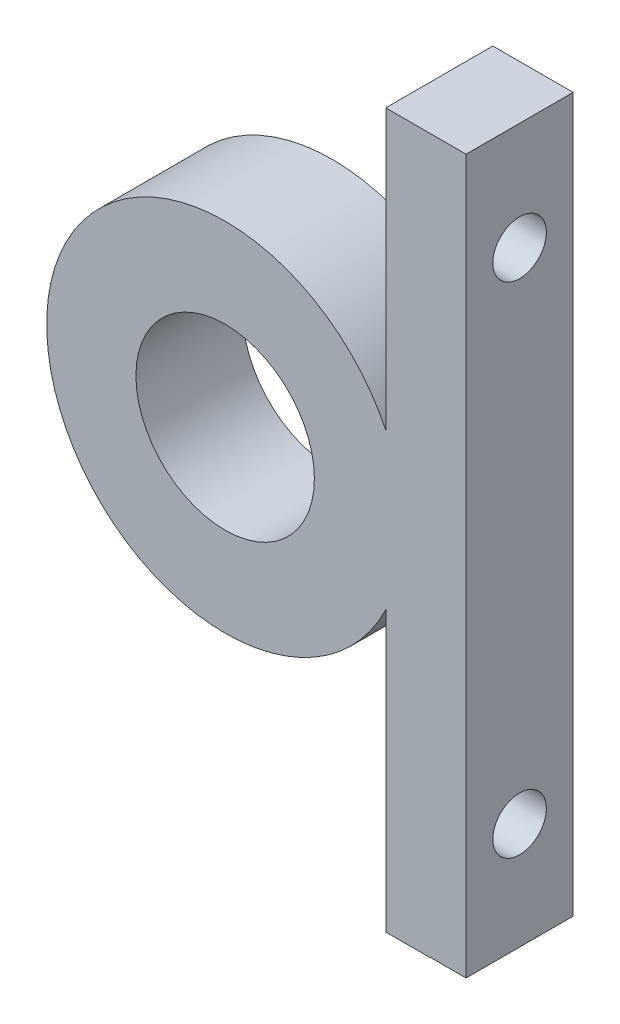
ISO-10303-21;
HEADER;
FILE_DESCRIPTION(('STEP AP214'),'2;1');
FILE_NAME('part.step','',(''),(''),'','','');
FILE_SCHEMA(('AUTOMOTIVE_DESIGN { 1 0 10303 214 1 1 1 1 }'));
ENDSEC;
DATA;
#1=APPLICATION_CONTEXT('core data for automotive mechanical design processes');
#2=APPLICATION_PROTOCOL_DEFINITION('international standard','automotive_design',2000,#1);
#3=PRODUCT_CONTEXT('',#1,'mechanical');
#4=PRODUCT('Part','Part','',(#3));
#5=PRODUCT_RELATED_PRODUCT_CATEGORY('part','',(#4));
#6=PRODUCT_DEFINITION_FORMATION('','',#4);
#7=PRODUCT_DEFINITION_CONTEXT('part definition',#1,'design');
#8=PRODUCT_DEFINITION('design','',#6,#7);
#9=PRODUCT_DEFINITION_SHAPE('','',#8);
#10=(LENGTH_UNIT() NAMED_UNIT(*) SI_UNIT(.MILLI.,.METRE.));
#11=(NAMED_UNIT(*) PLANE_ANGLE_UNIT() SI_UNIT($,.RADIAN.));
#12=(NAMED_UNIT(*) SI_UNIT($,.STERADIAN.) SOLID_ANGLE_UNIT());
#13=UNCERTAINTY_MEASURE_WITH_UNIT(LENGTH_MEASURE(1.E-05),#10,'distance_accuracy_value','');
#14=(GEOMETRIC_REPRESENTATION_CONTEXT(3) GLOBAL_UNCERTAINTY_ASSIGNED_CONTEXT((#13)) GLOBAL_UNIT_ASSIGNED_CONTEXT((#10,
#11,#12)) REPRESENTATION_CONTEXT('',''));
#15=CARTESIAN_POINT('',(0.,0.,0.));
#16=DIRECTION('',(0.,0.,1.));
#17=DIRECTION('',(1.,0.,0.));
#18=AXIS2_PLACEMENT_3D('',#15,#16,#17);
#19=CARTESIAN_POINT('',(0.,-28.0159542257824,7.62));
#20=DIRECTION('',(0.,1.,0.));
#21=DIRECTION('',(0.,0.,1.));
#22=AXIS2_PLACEMENT_3D('',#19,#20,#21);
#23=PLANE('',#22);
#24=DIRECTION('',(1.,0.,0.));
#25=VECTOR('',#24,1.);
#26=CARTESIAN_POINT('',(0.,-28.0159542257824,0.));
#27=LINE('',#26,#25);
#28=CARTESIAN_POINT('',(0.,-28.0159542257824,0.));
#29=VERTEX_POINT('',#28);
#30=CARTESIAN_POINT('',(3.175,-28.0159542257824,0.));
#31=VERTEX_POINT('',#30);
#32=EDGE_CURVE('E159',#29,#31,#27,.T.);
#33=ORIENTED_EDGE('',*,*,#32,.T.);
#34=DIRECTION('',(0.,0.,-1.));
#35=VECTOR('',#34,1.);
#36=CARTESIAN_POINT('',(3.175,-28.0159542257824,7.62));
#37=LINE('',#36,#35);
#38=CARTESIAN_POINT('',(3.175,-28.0159542257824,7.62));
#39=VERTEX_POINT('',#38);
#40=EDGE_CURVE('E12',#39,#31,#37,.T.);
#41=ORIENTED_EDGE('',*,*,#40,.F.);
#42=DIRECTION('',(1.,0.,0.));
#43=VECTOR('',#42,1.);
#44=CARTESIAN_POINT('',(0.,-28.0159542257824,7.62));
#45=LINE('',#44,#43);
#46=CARTESIAN_POINT('',(0.,-28.0159542257824,7.62));
#47=VERTEX_POINT('',#46);
#48=EDGE_CURVE('E181',#47,#39,#45,.T.);
#49=ORIENTED_EDGE('',*,*,#48,.F.);
#50=DIRECTION('',(0.,0.,-1.));
#51=VECTOR('',#50,1.);
#52=CARTESIAN_POINT('',(0.,-28.0159542257824,7.62));
#53=LINE('',#52,#51);
#54=EDGE_CURVE('E158',#47,#29,#53,.T.);
#55=ORIENTED_EDGE('',*,*,#54,.T.);
#56=EDGE_LOOP('',(#33,#41,#49,#55));
#57=FACE_BOUND('',#56,.T.);
#58=ADVANCED_FACE('F57',(#57),#23,.F.);
#59=CARTESIAN_POINT('',(3.175,0.,7.62));
#60=DIRECTION('',(-1.,0.,0.));
#61=DIRECTION('',(0.,-1.,0.));
#62=AXIS2_PLACEMENT_3D('',#59,#60,#61);
#63=PLANE('',#62);
#64=DIRECTION('',(0.,1.,0.));
#65=VECTOR('',#64,1.);
#66=CARTESIAN_POINT('',(3.175,0.,0.));
#67=LINE('',#66,#65);
#68=CARTESIAN_POINT('',(3.175,-27.9921227790191,0.));
#69=VERTEX_POINT('',#68);
#70=EDGE_CURVE('E163',#31,#69,#67,.T.);
#71=ORIENTED_EDGE('',*,*,#70,.T.);
#72=DIRECTION('',(0.,0.,1.));
#73=VECTOR('',#72,1.);
#74=CARTESIAN_POINT('',(3.175,-27.9921227790191,0.));
#75=LINE('',#74,#73);
#76=CARTESIAN_POINT('',(3.175,-27.9921227790191,7.62));
#77=VERTEX_POINT('',#76);
#78=EDGE_CURVE('E204',#69,#77,#75,.T.);
#79=ORIENTED_EDGE('',*,*,#78,.T.);
#80=DIRECTION('',(0.,1.,0.));
#81=VECTOR('',#80,1.);
#82=CARTESIAN_POINT('',(3.175,0.,7.62));
#83=LINE('',#82,#81);
#84=EDGE_CURVE('E114',#39,#77,#83,.T.);
#85=ORIENTED_EDGE('',*,*,#84,.F.);
#86=ORIENTED_EDGE('',*,*,#40,.T.);
#87=EDGE_LOOP('',(#71,#79,#85,#86));
#88=FACE_BOUND('',#87,.T.);
#89=ADVANCED_FACE('F222',(#88),#63,.F.);
#90=CARTESIAN_POINT('',(0.,22.7840457742176,7.62));
#91=DIRECTION('',(0.,-1.,0.));
#92=DIRECTION('',(0.,0.,-1.));
#93=AXIS2_PLACEMENT_3D('',#90,#91,#92);
#94=PLANE('',#93);
#95=DIRECTION('',(-1.,0.,0.));
#96=VECTOR('',#95,1.);
#97=CARTESIAN_POINT('',(0.,22.7840457742176,0.));
#98=LINE('',#97,#96);
#99=CARTESIAN_POINT('',(5.715,22.7840457742176,0.));
#100=VERTEX_POINT('',#99);
#101=CARTESIAN_POINT('',(0.,22.7840457742176,0.));
#102=VERTEX_POINT('',#101);
#103=EDGE_CURVE('E167',#100,#102,#98,.T.);
#104=ORIENTED_EDGE('',*,*,#103,.T.);
#105=DIRECTION('',(0.,0.,-1.));
#106=VECTOR('',#105,1.);
#107=CARTESIAN_POINT('',(0.,22.7840457742176,7.62));
#108=LINE('',#107,#106);
#109=CARTESIAN_POINT('',(0.,22.7840457742176,7.62));
#110=VERTEX_POINT('',#109);
#111=EDGE_CURVE('E66',#110,#102,#108,.T.);
#112=ORIENTED_EDGE('',*,*,#111,.F.);
#113=DIRECTION('',(-1.,0.,0.));
#114=VECTOR('',#113,1.);
#115=CARTESIAN_POINT('',(0.,22.7840457742176,7.62));
#116=LINE('',#115,#114);
#117=CARTESIAN_POINT('',(5.715,22.7840457742176,7.62));
#118=VERTEX_POINT('',#117);
#119=EDGE_CURVE('E131',#118,#110,#116,.T.);
#120=ORIENTED_EDGE('',*,*,#119,.F.);
#121=DIRECTION('',(0.,0.,1.));
#122=VECTOR('',#121,1.);
#123=CARTESIAN_POINT('',(5.715,22.7840457742176,0.));
#124=LINE('',#123,#122);
#125=EDGE_CURVE('E190',#100,#118,#124,.T.);
#126=ORIENTED_EDGE('',*,*,#125,.F.);
#127=EDGE_LOOP('',(#104,#112,#120,#126));
#128=FACE_BOUND('',#127,.T.);
#129=ADVANCED_FACE('F261',(#128),#94,.F.);
#130=CARTESIAN_POINT('',(0.,0.,7.62));
#131=DIRECTION('',(1.,0.,0.));
#132=DIRECTION('',(0.,1.,0.));
#133=AXIS2_PLACEMENT_3D('',#130,#131,#132);
#134=PLANE('',#133);
#135=CARTESIAN_POINT('',(0.,15.1166714258176,3.81));
#136=DIRECTION('',(1.,0.,0.));
#137=DIRECTION('',(0.,1.,0.));
#138=AXIS2_PLACEMENT_3D('',#135,#136,#137);
#139=CIRCLE('',#138,1.905);
#140=CARTESIAN_POINT('',(0.,13.2116714258176,3.81));
#141=VERTEX_POINT('',#140);
#142=EDGE_CURVE('E60',#141,#141,#139,.F.);
#143=ORIENTED_EDGE('',*,*,#142,.F.);
#144=EDGE_LOOP('',(#143));
#145=FACE_BOUND('',#144,.T.);
#146=DIRECTION('',(0.,-1.,0.));
#147=VECTOR('',#146,1.);
#148=CARTESIAN_POINT('',(0.,0.,0.));
#149=LINE('',#148,#147);
#150=CARTESIAN_POINT('',(0.,2.91984743251426,0.));
#151=VERTEX_POINT('',#150);
#152=EDGE_CURVE('E141',#102,#151,#149,.T.);
#153=ORIENTED_EDGE('',*,*,#152,.T.);
#154=DIRECTION('',(0.,0.,-1.));
#155=VECTOR('',#154,1.);
#156=CARTESIAN_POINT('',(0.,2.91984743251426,7.62));
#157=LINE('',#156,#155);
#158=CARTESIAN_POINT('',(0.,2.91984743251426,7.62));
#159=VERTEX_POINT('',#158);
#160=EDGE_CURVE('E138',#159,#151,#157,.T.);
#161=ORIENTED_EDGE('',*,*,#160,.F.);
#162=DIRECTION('',(0.,-1.,0.));
#163=VECTOR('',#162,1.);
#164=CARTESIAN_POINT('',(0.,0.,7.62));
#165=LINE('',#164,#163);
#166=EDGE_CURVE('E122',#110,#159,#165,.T.);
#167=ORIENTED_EDGE('',*,*,#166,.F.);
#168=ORIENTED_EDGE('',*,*,#111,.T.);
#169=EDGE_LOOP('',(#153,#161,#167,#168));
#170=FACE_BOUND('',#169,.T.);
#171=ADVANCED_FACE('F139',(#145,#170),#134,.F.);
#172=CARTESIAN_POINT('',(-11.43,-2.61595422578239,7.62));
#173=DIRECTION('',(0.,0.,-1.));
#174=DIRECTION('',(-1.,0.,0.));
#175=AXIS2_PLACEMENT_3D('',#172,#173,#174);
#176=CYLINDRICAL_SURFACE('',#175,12.7);
#177=CARTESIAN_POINT('',(-11.43,-2.61595422578239,0.));
#178=DIRECTION('',(0.,0.,1.));
#179=DIRECTION('',(1.,0.,0.));
#180=AXIS2_PLACEMENT_3D('',#177,#178,#179);
#181=CIRCLE('',#180,12.7);
#182=CARTESIAN_POINT('',(0.,-8.15175588407905,0.));
#183=VERTEX_POINT('',#182);
#184=EDGE_CURVE('E172',#151,#183,#181,.T.);
#185=ORIENTED_EDGE('',*,*,#184,.T.);
#186=DIRECTION('',(0.,0.,-1.));
#187=VECTOR('',#186,1.);
#188=CARTESIAN_POINT('',(0.,-8.15175588407905,7.62));
#189=LINE('',#188,#187);
#190=CARTESIAN_POINT('',(0.,-8.15175588407905,7.62));
#191=VERTEX_POINT('',#190);
#192=EDGE_CURVE('E145',#191,#183,#189,.T.);
#193=ORIENTED_EDGE('',*,*,#192,.F.);
#194=CARTESIAN_POINT('',(-11.43,-2.61595422578239,7.62));
#195=DIRECTION('',(0.,0.,1.));
#196=DIRECTION('',(1.,0.,0.));
#197=AXIS2_PLACEMENT_3D('',#194,#195,#196);
#198=CIRCLE('',#197,12.7);
#199=EDGE_CURVE('E127',#159,#191,#198,.T.);
#200=ORIENTED_EDGE('',*,*,#199,.F.);
#201=ORIENTED_EDGE('',*,*,#160,.T.);
#202=EDGE_LOOP('',(#185,#193,#200,#201));
#203=FACE_BOUND('',#202,.T.);
#204=ADVANCED_FACE('F147',(#203),#176,.T.);
#205=CARTESIAN_POINT('',(0.,0.,7.62));
#206=DIRECTION('',(1.,0.,0.));
#207=DIRECTION('',(0.,1.,0.));
#208=AXIS2_PLACEMENT_3D('',#205,#206,#207);
#209=PLANE('',#208);
#210=CARTESIAN_POINT('',(0.,-20.3959542257824,3.80999999999999));
#211=DIRECTION('',(1.,0.,0.));
#212=DIRECTION('',(0.,1.,0.));
#213=AXIS2_PLACEMENT_3D('',#210,#211,#212);
#214=CIRCLE('',#213,1.905);
#215=CARTESIAN_POINT('',(0.,-22.3009542257824,3.80999999999999));
#216=VERTEX_POINT('',#215);
#217=EDGE_CURVE('E187',#216,#216,#214,.F.);
#218=ORIENTED_EDGE('',*,*,#217,.F.);
#219=EDGE_LOOP('',(#218));
#220=FACE_BOUND('',#219,.T.);
#221=DIRECTION('',(0.,-1.,0.));
#222=VECTOR('',#221,1.);
#223=CARTESIAN_POINT('',(0.,0.,0.));
#224=LINE('',#223,#222);
#225=EDGE_CURVE('E107',#183,#29,#224,.T.);
#226=ORIENTED_EDGE('',*,*,#225,.T.);
#227=ORIENTED_EDGE('',*,*,#54,.F.);
#228=DIRECTION('',(0.,-1.,0.));
#229=VECTOR('',#228,1.);
#230=CARTESIAN_POINT('',(0.,0.,7.62));
#231=LINE('',#230,#229);
#232=EDGE_CURVE('E83',#191,#47,#231,.T.);
#233=ORIENTED_EDGE('',*,*,#232,.F.);
#234=ORIENTED_EDGE('',*,*,#192,.T.);
#235=EDGE_LOOP('',(#226,#227,#233,#234));
#236=FACE_BOUND('',#235,.T.);
#237=ADVANCED_FACE('F262',(#220,#236),#209,.F.);
#238=CARTESIAN_POINT('',(-11.43,-2.61595422578239,7.62));
#239=DIRECTION('',(0.,0.,-1.));
#240=DIRECTION('',(-1.,0.,0.));
#241=AXIS2_PLACEMENT_3D('',#238,#239,#240);
#242=CYLINDRICAL_SURFACE('',#241,6.35);
#243=CARTESIAN_POINT('',(-11.43,-2.61595422578239,7.62));
#244=DIRECTION('',(0.,0.,1.));
#245=DIRECTION('',(1.,0.,0.));
#246=AXIS2_PLACEMENT_3D('',#243,#244,#245);
#247=CIRCLE('',#246,6.35);
#248=CARTESIAN_POINT('',(-5.08,-2.61595422578239,7.62));
#249=VERTEX_POINT('',#248);
#250=EDGE_CURVE('E151',#249,#249,#247,.T.);
#251=ORIENTED_EDGE('',*,*,#250,.T.);
#252=EDGE_LOOP('',(#251));
#253=FACE_BOUND('',#252,.T.);
#254=CARTESIAN_POINT('',(-11.43,-2.61595422578239,0.));
#255=DIRECTION('',(0.,0.,1.));
#256=DIRECTION('',(1.,0.,0.));
#257=AXIS2_PLACEMENT_3D('',#254,#255,#256);
#258=CIRCLE('',#257,6.35);
#259=CARTESIAN_POINT('',(-5.08,-2.61595422578239,0.));
#260=VERTEX_POINT('',#259);
#261=EDGE_CURVE('E177',#260,#260,#258,.T.);
#262=ORIENTED_EDGE('',*,*,#261,.F.);
#263=EDGE_LOOP('',(#262));
#264=FACE_BOUND('',#263,.T.);
#265=ADVANCED_FACE('F264',(#253,#264),#242,.F.);
#266=CARTESIAN_POINT('',(0.,0.,7.62));
#267=DIRECTION('',(0.,0.,1.));
#268=DIRECTION('',(1.,0.,0.));
#269=AXIS2_PLACEMENT_3D('',#266,#267,#268);
#270=PLANE('',#269);
#271=ORIENTED_EDGE('',*,*,#48,.T.);
#272=ORIENTED_EDGE('',*,*,#84,.T.);
#273=DIRECTION('',(1.,0.,0.));
#274=VECTOR('',#273,1.);
#275=CARTESIAN_POINT('',(3.175,-27.9921227790191,7.62));
#276=LINE('',#275,#274);
#277=CARTESIAN_POINT('',(5.71500000000001,-27.9921227790191,7.62));
#278=VERTEX_POINT('',#277);
#279=EDGE_CURVE('E74',#77,#278,#276,.T.);
#280=ORIENTED_EDGE('',*,*,#279,.T.);
#281=DIRECTION('',(0.,1.,0.));
#282=VECTOR('',#281,1.);
#283=CARTESIAN_POINT('',(5.715,22.7840457742176,7.62));
#284=LINE('',#283,#282);
#285=EDGE_CURVE('E207',#278,#118,#284,.T.);
#286=ORIENTED_EDGE('',*,*,#285,.T.);
#287=ORIENTED_EDGE('',*,*,#119,.T.);
#288=ORIENTED_EDGE('',*,*,#166,.T.);
#289=ORIENTED_EDGE('',*,*,#199,.T.);
#290=ORIENTED_EDGE('',*,*,#232,.T.);
#291=EDGE_LOOP('',(#271,#272,#280,#286,#287,#288,#289,#290));
#292=FACE_BOUND('',#291,.T.);
#293=ORIENTED_EDGE('',*,*,#250,.F.);
#294=EDGE_LOOP('',(#293));
#295=FACE_BOUND('',#294,.T.);
#296=ADVANCED_FACE('F124',(#292,#295),#270,.T.);
#297=CARTESIAN_POINT('',(0.,0.,0.));
#298=DIRECTION('',(0.,0.,1.));
#299=DIRECTION('',(1.,0.,0.));
#300=AXIS2_PLACEMENT_3D('',#297,#298,#299);
#301=PLANE('',#300);
#302=ORIENTED_EDGE('',*,*,#32,.F.);
#303=ORIENTED_EDGE('',*,*,#225,.F.);
#304=ORIENTED_EDGE('',*,*,#184,.F.);
#305=ORIENTED_EDGE('',*,*,#152,.F.);
#306=ORIENTED_EDGE('',*,*,#103,.F.);
#307=DIRECTION('',(0.,1.,0.));
#308=VECTOR('',#307,1.);
#309=CARTESIAN_POINT('',(5.715,22.7840457742176,0.));
#310=LINE('',#309,#308);
#311=CARTESIAN_POINT('',(5.71500000000001,-27.9921227790191,0.));
#312=VERTEX_POINT('',#311);
#313=EDGE_CURVE('E212',#312,#100,#310,.T.);
#314=ORIENTED_EDGE('',*,*,#313,.F.);
#315=DIRECTION('',(1.,0.,0.));
#316=VECTOR('',#315,1.);
#317=CARTESIAN_POINT('',(3.175,-27.9921227790191,0.));
#318=LINE('',#317,#316);
#319=EDGE_CURVE('E232',#69,#312,#318,.T.);
#320=ORIENTED_EDGE('',*,*,#319,.F.);
#321=ORIENTED_EDGE('',*,*,#70,.F.);
#322=EDGE_LOOP('',(#302,#303,#304,#305,#306,#314,#320,#321));
#323=FACE_BOUND('',#322,.T.);
#324=ORIENTED_EDGE('',*,*,#261,.T.);
#325=EDGE_LOOP('',(#324));
#326=FACE_BOUND('',#325,.T.);
#327=ADVANCED_FACE('F228',(#323,#326),#301,.F.);
#328=CARTESIAN_POINT('',(13.335,-20.3959542257824,3.80999999999999));
#329=DIRECTION('',(-1.,0.,0.));
#330=DIRECTION('',(0.,-1.,0.));
#331=AXIS2_PLACEMENT_3D('',#328,#329,#330);
#332=CYLINDRICAL_SURFACE('',#331,1.905);
#333=CARTESIAN_POINT('',(5.71500000000001,-20.3959542257824,3.80999999999999));
#334=DIRECTION('',(1.,0.,0.));
#335=DIRECTION('',(0.,1.,0.));
#336=AXIS2_PLACEMENT_3D('',#333,#334,#335);
#337=CIRCLE('',#336,1.905);
#338=CARTESIAN_POINT('',(5.71500000000001,-22.3009542257824,3.80999999999999));
#339=VERTEX_POINT('',#338);
#340=EDGE_CURVE('E240',#339,#339,#337,.T.);
#341=CARTESIAN_POINT('',(0.,-22.3009542257824,3.80999999999999));
#342=CARTESIAN_POINT('',(0.059531250000002,-22.3009542257824,3.80999999999999));
#343=CARTESIAN_POINT('',(0.119062500000002,-22.3009542257824,3.80999999999999));
#344=CARTESIAN_POINT('',(0.238125000000002,-22.3009542257824,3.80999999999999));
#345=CARTESIAN_POINT('',(0.297656250000002,-22.3009542257824,3.80999999999999));
#346=CARTESIAN_POINT('',(0.416718750000002,-22.3009542257824,3.80999999999999));
#347=CARTESIAN_POINT('',(0.476250000000002,-22.3009542257824,3.80999999999999));
#348=CARTESIAN_POINT('',(0.595312500000002,-22.3009542257824,3.80999999999999));
#349=CARTESIAN_POINT('',(0.654843750000002,-22.3009542257824,3.80999999999999));
#350=CARTESIAN_POINT('',(0.773906250000002,-22.3009542257824,3.80999999999999));
#351=CARTESIAN_POINT('',(0.833437500000002,-22.3009542257824,3.80999999999999));
#352=CARTESIAN_POINT('',(0.952500000000002,-22.3009542257824,3.80999999999999));
#353=CARTESIAN_POINT('',(1.01203125,-22.3009542257824,3.80999999999999));
#354=CARTESIAN_POINT('',(1.13109375,-22.3009542257824,3.80999999999999));
#355=CARTESIAN_POINT('',(1.190625,-22.3009542257824,3.80999999999999));
#356=CARTESIAN_POINT('',(1.3096875,-22.3009542257824,3.80999999999999));
#357=CARTESIAN_POINT('',(1.36921875,-22.3009542257824,3.80999999999999));
#358=CARTESIAN_POINT('',(1.48828125,-22.3009542257824,3.80999999999999));
#359=CARTESIAN_POINT('',(1.5478125,-22.3009542257824,3.80999999999999));
#360=CARTESIAN_POINT('',(1.666875,-22.3009542257824,3.80999999999999));
#361=CARTESIAN_POINT('',(1.72640625,-22.3009542257824,3.80999999999999));
#362=CARTESIAN_POINT('',(1.84546875,-22.3009542257824,3.80999999999999));
#363=CARTESIAN_POINT('',(1.905,-22.3009542257824,3.80999999999999));
#364=CARTESIAN_POINT('',(2.0240625,-22.3009542257824,3.80999999999999));
#365=CARTESIAN_POINT('',(2.08359375,-22.3009542257824,3.80999999999999));
#366=CARTESIAN_POINT('',(2.20265625,-22.3009542257824,3.80999999999999));
#367=CARTESIAN_POINT('',(2.2621875,-22.3009542257824,3.80999999999999));
#368=CARTESIAN_POINT('',(2.38125,-22.3009542257824,3.80999999999999));
#369=CARTESIAN_POINT('',(2.44078125,-22.3009542257824,3.80999999999999));
#370=CARTESIAN_POINT('',(2.55984375,-22.3009542257824,3.80999999999999));
#371=CARTESIAN_POINT('',(2.619375,-22.3009542257824,3.80999999999999));
#372=CARTESIAN_POINT('',(2.7384375,-22.3009542257824,3.80999999999999));
#373=CARTESIAN_POINT('',(2.79796875,-22.3009542257824,3.80999999999999));
#374=CARTESIAN_POINT('',(2.91703125,-22.3009542257824,3.80999999999999));
#375=CARTESIAN_POINT('',(2.9765625,-22.3009542257824,3.80999999999999));
#376=CARTESIAN_POINT('',(3.095625,-22.3009542257824,3.80999999999999));
#377=CARTESIAN_POINT('',(3.15515625,-22.3009542257824,3.80999999999999));
#378=CARTESIAN_POINT('',(3.27421875,-22.3009542257824,3.80999999999999));
#379=CARTESIAN_POINT('',(3.33375,-22.3009542257824,3.80999999999999));
#380=CARTESIAN_POINT('',(3.4528125,-22.3009542257824,3.80999999999999));
#381=CARTESIAN_POINT('',(3.51234375,-22.3009542257824,3.80999999999999));
#382=CARTESIAN_POINT('',(3.63140625,-22.3009542257824,3.80999999999999));
#383=CARTESIAN_POINT('',(3.6909375,-22.3009542257824,3.80999999999999));
#384=CARTESIAN_POINT('',(3.81,-22.3009542257824,3.80999999999999));
#385=CARTESIAN_POINT('',(3.86953125000001,-22.3009542257824,3.80999999999999));
#386=CARTESIAN_POINT('',(3.98859375000001,-22.3009542257824,3.80999999999999));
#387=CARTESIAN_POINT('',(4.04812500000001,-22.3009542257824,3.80999999999999));
#388=CARTESIAN_POINT('',(4.16718750000001,-22.3009542257824,3.80999999999999));
#389=CARTESIAN_POINT('',(4.22671875000001,-22.3009542257824,3.80999999999999));
#390=CARTESIAN_POINT('',(4.34578125000001,-22.3009542257824,3.80999999999999));
#391=CARTESIAN_POINT('',(4.4053125,-22.3009542257824,3.80999999999999));
#392=CARTESIAN_POINT('',(4.52437500000001,-22.3009542257824,3.80999999999999));
#393=CARTESIAN_POINT('',(4.58390625,-22.3009542257824,3.80999999999999));
#394=CARTESIAN_POINT('',(4.70296875000001,-22.3009542257824,3.80999999999999));
#395=CARTESIAN_POINT('',(4.76250000000001,-22.3009542257824,3.80999999999999));
#396=CARTESIAN_POINT('',(4.88156250000001,-22.3009542257824,3.80999999999999));
#397=CARTESIAN_POINT('',(4.94109375000001,-22.3009542257824,3.80999999999999));
#398=CARTESIAN_POINT('',(5.06015625000001,-22.3009542257824,3.80999999999999));
#399=CARTESIAN_POINT('',(5.11968750000001,-22.3009542257824,3.80999999999999));
#400=CARTESIAN_POINT('',(5.23875000000001,-22.3009542257824,3.80999999999999));
#401=CARTESIAN_POINT('',(5.29828125000001,-22.3009542257824,3.80999999999999));
#402=CARTESIAN_POINT('',(5.41734375000001,-22.3009542257824,3.80999999999999));
#403=CARTESIAN_POINT('',(5.47687500000001,-22.3009542257824,3.80999999999999));
#404=CARTESIAN_POINT('',(5.59593750000001,-22.3009542257824,3.80999999999999));
#405=CARTESIAN_POINT('',(5.65546875000001,-22.3009542257824,3.80999999999999));
#406=CARTESIAN_POINT('',(5.71500000000001,-22.3009542257824,3.80999999999999));
#407=B_SPLINE_CURVE_WITH_KNOTS('',3,(#341,#342,#343,#344,#345,#346,#347,#348,#349,#350,#351,
#352,#353,#354,#355,#356,#357,#358,#359,#360,#361,#362,#363,#364,#365,#366,#367,#368,#369,#370,
#371,#372,#373,#374,#375,#376,#377,#378,#379,#380,#381,#382,#383,#384,#385,#386,#387,#388,#389,
#390,#391,#392,#393,#394,#395,#396,#397,#398,#399,#400,#401,#402,#403,#404,#405,#406),
.UNSPECIFIED.,.F.,.F.,(4,2,2,2,2,2,2,2,2,2,2,2,2,2,2,2,2,2,2,2,2,2,2,2,2,2,2,2,2,2,2,2,4),(0.,
0.178593750000001,0.3571875,0.535781250000001,0.714375,0.892968750000001,1.0715625,1.25015625,
1.42875,1.60734375,1.7859375,1.96453125,2.143125,2.32171875,2.5003125,2.67890625,2.8575,
3.03609375,3.2146875,3.39328125,3.571875,3.75046875,3.9290625,4.10765625,4.28625,4.46484375,
4.6434375,4.82203125,5.000625,5.17921875,5.3578125,5.53640625,5.715),.UNSPECIFIED.);
#408=EDGE_CURVE('BSEAM252',#216,#339,#407,.T.);
#409=ORIENTED_EDGE('',*,*,#217,.T.);
#410=ORIENTED_EDGE('',*,*,#340,.T.);
#411=ORIENTED_EDGE('',*,*,#408,.T.);
#412=ORIENTED_EDGE('',*,*,#408,.F.);
#413=EDGE_LOOP('',(#409,#411,#410,#412));
#414=FACE_BOUND('',#413,.T.);
#415=ADVANCED_FACE('F252',(#414),#332,.F.);
#416=CARTESIAN_POINT('',(13.335,15.1166714258176,3.81));
#417=DIRECTION('',(-1.,0.,0.));
#418=DIRECTION('',(0.,-1.,0.));
#419=AXIS2_PLACEMENT_3D('',#416,#417,#418);
#420=CYLINDRICAL_SURFACE('',#419,1.905);
#421=CARTESIAN_POINT('',(5.715,15.1166714258176,3.81));
#422=DIRECTION('',(1.,0.,0.));
#423=DIRECTION('',(0.,1.,0.));
#424=AXIS2_PLACEMENT_3D('',#421,#422,#423);
#425=CIRCLE('',#424,1.905);
#426=CARTESIAN_POINT('',(5.715,13.2116714258176,3.81));
#427=VERTEX_POINT('',#426);
#428=EDGE_CURVE('E243',#427,#427,#425,.T.);
#429=CARTESIAN_POINT('',(0.,13.2116714258176,3.81));
#430=CARTESIAN_POINT('',(0.059531250000002,13.2116714258176,3.81));
#431=CARTESIAN_POINT('',(0.119062500000002,13.2116714258176,3.81));
#432=CARTESIAN_POINT('',(0.238125000000002,13.2116714258176,3.81));
#433=CARTESIAN_POINT('',(0.297656250000002,13.2116714258176,3.81));
#434=CARTESIAN_POINT('',(0.416718750000002,13.2116714258176,3.81));
#435=CARTESIAN_POINT('',(0.476250000000002,13.2116714258176,3.81));
#436=CARTESIAN_POINT('',(0.595312500000002,13.2116714258176,3.81));
#437=CARTESIAN_POINT('',(0.654843750000002,13.2116714258176,3.81));
#438=CARTESIAN_POINT('',(0.773906250000002,13.2116714258176,3.81));
#439=CARTESIAN_POINT('',(0.833437500000002,13.2116714258176,3.81));
#440=CARTESIAN_POINT('',(0.952500000000002,13.2116714258176,3.81));
#441=CARTESIAN_POINT('',(1.01203125,13.2116714258176,3.81));
#442=CARTESIAN_POINT('',(1.13109375,13.2116714258176,3.81));
#443=CARTESIAN_POINT('',(1.190625,13.2116714258176,3.81));
#444=CARTESIAN_POINT('',(1.3096875,13.2116714258176,3.81));
#445=CARTESIAN_POINT('',(1.36921875,13.2116714258176,3.81));
#446=CARTESIAN_POINT('',(1.48828125,13.2116714258176,3.81));
#447=CARTESIAN_POINT('',(1.5478125,13.2116714258176,3.81));
#448=CARTESIAN_POINT('',(1.666875,13.2116714258176,3.81));
#449=CARTESIAN_POINT('',(1.72640625,13.2116714258176,3.81));
#450=CARTESIAN_POINT('',(1.84546875,13.2116714258176,3.81));
#451=CARTESIAN_POINT('',(1.905,13.2116714258176,3.81));
#452=CARTESIAN_POINT('',(2.0240625,13.2116714258176,3.81));
#453=CARTESIAN_POINT('',(2.08359375,13.2116714258176,3.81));
#454=CARTESIAN_POINT('',(2.20265625,13.2116714258176,3.81));
#455=CARTESIAN_POINT('',(2.2621875,13.2116714258176,3.81));
#456=CARTESIAN_POINT('',(2.38125,13.2116714258176,3.81));
#457=CARTESIAN_POINT('',(2.44078125,13.2116714258176,3.81));
#458=CARTESIAN_POINT('',(2.55984375,13.2116714258176,3.81));
#459=CARTESIAN_POINT('',(2.619375,13.2116714258176,3.81));
#460=CARTESIAN_POINT('',(2.7384375,13.2116714258176,3.81));
#461=CARTESIAN_POINT('',(2.79796875,13.2116714258176,3.81));
#462=CARTESIAN_POINT('',(2.91703125,13.2116714258176,3.81));
#463=CARTESIAN_POINT('',(2.9765625,13.2116714258176,3.81));
#464=CARTESIAN_POINT('',(3.095625,13.2116714258176,3.81));
#465=CARTESIAN_POINT('',(3.15515625,13.2116714258176,3.81));
#466=CARTESIAN_POINT('',(3.27421875,13.2116714258176,3.81));
#467=CARTESIAN_POINT('',(3.33375,13.2116714258176,3.81));
#468=CARTESIAN_POINT('',(3.4528125,13.2116714258176,3.81));
#469=CARTESIAN_POINT('',(3.51234375,13.2116714258176,3.81));
#470=CARTESIAN_POINT('',(3.63140625,13.2116714258176,3.81));
#471=CARTESIAN_POINT('',(3.6909375,13.2116714258176,3.81));
#472=CARTESIAN_POINT('',(3.81,13.2116714258176,3.81));
#473=CARTESIAN_POINT('',(3.86953125,13.2116714258176,3.81));
#474=CARTESIAN_POINT('',(3.98859375,13.2116714258176,3.81));
#475=CARTESIAN_POINT('',(4.048125,13.2116714258176,3.81));
#476=CARTESIAN_POINT('',(4.1671875,13.2116714258176,3.81));
#477=CARTESIAN_POINT('',(4.22671875,13.2116714258176,3.81));
#478=CARTESIAN_POINT('',(4.34578125,13.2116714258176,3.81));
#479=CARTESIAN_POINT('',(4.4053125,13.2116714258176,3.81));
#480=CARTESIAN_POINT('',(4.524375,13.2116714258176,3.81));
#481=CARTESIAN_POINT('',(4.58390625,13.2116714258176,3.81));
#482=CARTESIAN_POINT('',(4.70296875,13.2116714258176,3.81));
#483=CARTESIAN_POINT('',(4.7625,13.2116714258176,3.81));
#484=CARTESIAN_POINT('',(4.8815625,13.2116714258176,3.81));
#485=CARTESIAN_POINT('',(4.94109375,13.2116714258176,3.81));
#486=CARTESIAN_POINT('',(5.06015625,13.2116714258176,3.81));
#487=CARTESIAN_POINT('',(5.1196875,13.2116714258176,3.81));
#488=CARTESIAN_POINT('',(5.23875,13.2116714258176,3.81));
#489=CARTESIAN_POINT('',(5.29828125,13.2116714258176,3.81));
#490=CARTESIAN_POINT('',(5.41734375,13.2116714258176,3.81));
#491=CARTESIAN_POINT('',(5.476875,13.2116714258176,3.81));
#492=CARTESIAN_POINT('',(5.5959375,13.2116714258176,3.81));
#493=CARTESIAN_POINT('',(5.65546875,13.2116714258176,3.81));
#494=CARTESIAN_POINT('',(5.715,13.2116714258176,3.81));
#495=B_SPLINE_CURVE_WITH_KNOTS('',3,(#429,#430,#431,#432,#433,#434,#435,#436,#437,#438,#439,
#440,#441,#442,#443,#444,#445,#446,#447,#448,#449,#450,#451,#452,#453,#454,#455,#456,#457,#458,
#459,#460,#461,#462,#463,#464,#465,#466,#467,#468,#469,#470,#471,#472,#473,#474,#475,#476,#477,
#478,#479,#480,#481,#482,#483,#484,#485,#486,#487,#488,#489,#490,#491,#492,#493,#494),
.UNSPECIFIED.,.F.,.F.,(4,2,2,2,2,2,2,2,2,2,2,2,2,2,2,2,2,2,2,2,2,2,2,2,2,2,2,2,2,2,2,2,4),(0.,
0.178593750000001,0.3571875,0.535781250000001,0.714375,0.892968750000001,1.0715625,1.25015625,
1.42875,1.60734375,1.7859375,1.96453125,2.143125,2.32171875,2.5003125,2.67890625,2.8575,
3.03609375,3.2146875,3.39328125,3.571875,3.75046875,3.9290625,4.10765625,4.28625,4.46484375,
4.6434375,4.82203125,5.000625,5.17921875,5.3578125,5.53640625,5.715),.UNSPECIFIED.);
#496=EDGE_CURVE('BSEAM289',#141,#427,#495,.T.);
#497=ORIENTED_EDGE('',*,*,#142,.T.);
#498=ORIENTED_EDGE('',*,*,#428,.T.);
#499=ORIENTED_EDGE('',*,*,#496,.T.);
#500=ORIENTED_EDGE('',*,*,#496,.F.);
#501=EDGE_LOOP('',(#497,#499,#498,#500));
#502=FACE_BOUND('',#501,.T.);
#503=ADVANCED_FACE('F289',(#502),#420,.F.);
#504=CARTESIAN_POINT('',(3.175,-27.9921227790191,0.));
#505=DIRECTION('',(0.,-1.,0.));
#506=DIRECTION('',(0.,0.,-1.));
#507=AXIS2_PLACEMENT_3D('',#504,#505,#506);
#508=PLANE('',#507);
#509=ORIENTED_EDGE('',*,*,#279,.F.);
#510=ORIENTED_EDGE('',*,*,#78,.F.);
#511=ORIENTED_EDGE('',*,*,#319,.T.);
#512=DIRECTION('',(0.,0.,1.));
#513=VECTOR('',#512,1.);
#514=CARTESIAN_POINT('',(5.71500000000001,-27.9921227790191,0.));
#515=LINE('',#514,#513);
#516=EDGE_CURVE('E197',#312,#278,#515,.T.);
#517=ORIENTED_EDGE('',*,*,#516,.T.);
#518=EDGE_LOOP('',(#509,#510,#511,#517));
#519=FACE_BOUND('',#518,.T.);
#520=ADVANCED_FACE('F256',(#519),#508,.T.);
#521=CARTESIAN_POINT('',(5.715,22.7840457742176,0.));
#522=DIRECTION('',(1.,0.,0.));
#523=DIRECTION('',(0.,1.,0.));
#524=AXIS2_PLACEMENT_3D('',#521,#522,#523);
#525=PLANE('',#524);
#526=ORIENTED_EDGE('',*,*,#428,.F.);
#527=EDGE_LOOP('',(#526));
#528=FACE_BOUND('',#527,.T.);
#529=ORIENTED_EDGE('',*,*,#340,.F.);
#530=EDGE_LOOP('',(#529));
#531=FACE_BOUND('',#530,.T.);
#532=ORIENTED_EDGE('',*,*,#285,.F.);
#533=ORIENTED_EDGE('',*,*,#516,.F.);
#534=ORIENTED_EDGE('',*,*,#313,.T.);
#535=ORIENTED_EDGE('',*,*,#125,.T.);
#536=EDGE_LOOP('',(#532,#533,#534,#535));
#537=FACE_BOUND('',#536,.T.);
#538=ADVANCED_FACE('F254',(#528,#531,#537),#525,.T.);
#539=CLOSED_SHELL('',(#58,#89,#129,#171,#204,#237,#265,#296,#327,#415,#503,#520,#538));
#540=MANIFOLD_SOLID_BREP('B2',#539);
#541=ADVANCED_BREP_SHAPE_REPRESENTATION('',(#18,#540),#14);
#542=SHAPE_DEFINITION_REPRESENTATION(#9,#541);
ENDSEC;
END-ISO-10303-21;
